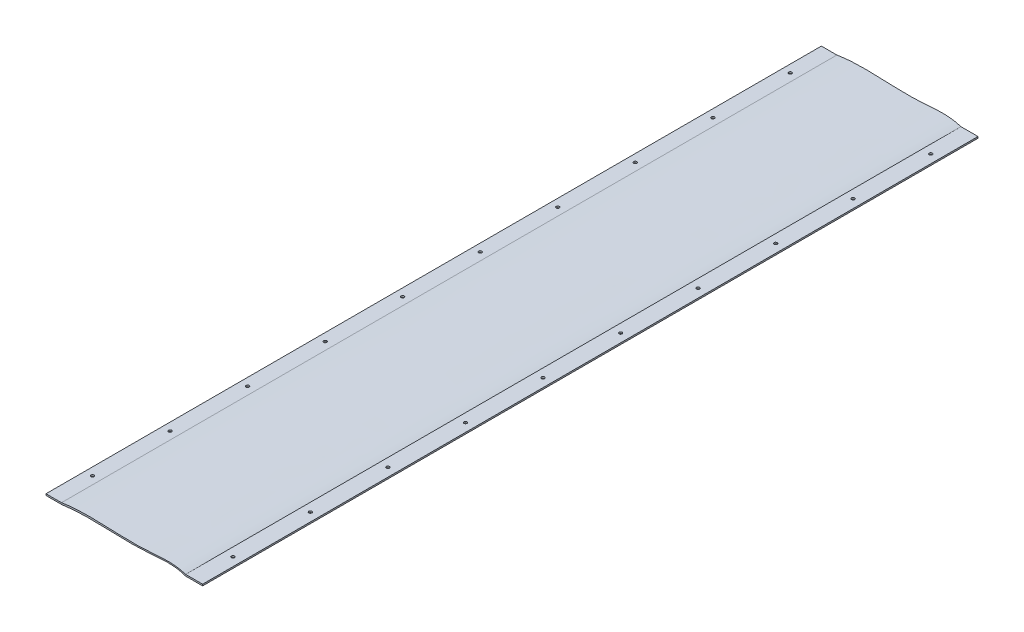
ISO-10303-21;
HEADER;
FILE_DESCRIPTION(('STEP AP214'),'2;1');
FILE_NAME('part.step','',(''),(''),'','','');
FILE_SCHEMA(('AUTOMOTIVE_DESIGN { 1 0 10303 214 1 1 1 1 }'));
ENDSEC;
DATA;
#1=APPLICATION_CONTEXT('core data for automotive mechanical design processes');
#2=APPLICATION_PROTOCOL_DEFINITION('international standard','automotive_design',2000,#1);
#3=PRODUCT_CONTEXT('',#1,'mechanical');
#4=PRODUCT('Part','Part','',(#3));
#5=PRODUCT_RELATED_PRODUCT_CATEGORY('part','',(#4));
#6=PRODUCT_DEFINITION_FORMATION('','',#4);
#7=PRODUCT_DEFINITION_CONTEXT('part definition',#1,'design');
#8=PRODUCT_DEFINITION('design','',#6,#7);
#9=PRODUCT_DEFINITION_SHAPE('','',#8);
#10=(LENGTH_UNIT() NAMED_UNIT(*) SI_UNIT(.MILLI.,.METRE.));
#11=(NAMED_UNIT(*) PLANE_ANGLE_UNIT() SI_UNIT($,.RADIAN.));
#12=(NAMED_UNIT(*) SI_UNIT($,.STERADIAN.) SOLID_ANGLE_UNIT());
#13=UNCERTAINTY_MEASURE_WITH_UNIT(LENGTH_MEASURE(1.E-05),#10,'distance_accuracy_value','');
#14=(GEOMETRIC_REPRESENTATION_CONTEXT(3) GLOBAL_UNCERTAINTY_ASSIGNED_CONTEXT((#13)) GLOBAL_UNIT_ASSIGNED_CONTEXT((#10,
#11,#12)) REPRESENTATION_CONTEXT('',''));
#15=CARTESIAN_POINT('',(0.,0.,0.));
#16=DIRECTION('',(0.,0.,1.));
#17=DIRECTION('',(1.,0.,0.));
#18=AXIS2_PLACEMENT_3D('',#15,#16,#17);
#19=CARTESIAN_POINT('',(102.,0.,-1000.));
#20=DIRECTION('',(0.,-1.,0.));
#21=DIRECTION('',(1.,0.,0.));
#22=AXIS2_PLACEMENT_3D('',#19,#20,#21);
#23=PLANE('',#22);
#24=CARTESIAN_POINT('',(91.,0.,-350.));
#25=DIRECTION('',(0.,-1.,0.));
#26=DIRECTION('',(1.,0.,0.));
#27=AXIS2_PLACEMENT_3D('',#24,#25,#26);
#28=CIRCLE('',#27,2.);
#29=CARTESIAN_POINT('',(93.,0.,-350.));
#30=VERTEX_POINT('',#29);
#31=EDGE_CURVE('E205',#30,#30,#28,.T.);
#32=ORIENTED_EDGE('',*,*,#31,.F.);
#33=EDGE_LOOP('',(#32));
#34=FACE_BOUND('',#33,.T.);
#35=CARTESIAN_POINT('',(91.,0.,-450.));
#36=DIRECTION('',(0.,-1.,0.));
#37=DIRECTION('',(1.,0.,0.));
#38=AXIS2_PLACEMENT_3D('',#35,#36,#37);
#39=CIRCLE('',#38,2.);
#40=CARTESIAN_POINT('',(93.,0.,-450.));
#41=VERTEX_POINT('',#40);
#42=EDGE_CURVE('E208',#41,#41,#39,.T.);
#43=ORIENTED_EDGE('',*,*,#42,.F.);
#44=EDGE_LOOP('',(#43));
#45=FACE_BOUND('',#44,.T.);
#46=CARTESIAN_POINT('',(91.,0.,-150.));
#47=DIRECTION('',(0.,-1.,0.));
#48=DIRECTION('',(1.,0.,0.));
#49=AXIS2_PLACEMENT_3D('',#46,#47,#48);
#50=CIRCLE('',#49,2.);
#51=CARTESIAN_POINT('',(93.,0.,-150.));
#52=VERTEX_POINT('',#51);
#53=EDGE_CURVE('E211',#52,#52,#50,.T.);
#54=ORIENTED_EDGE('',*,*,#53,.F.);
#55=EDGE_LOOP('',(#54));
#56=FACE_BOUND('',#55,.T.);
#57=CARTESIAN_POINT('',(91.,0.,-250.));
#58=DIRECTION('',(0.,-1.,0.));
#59=DIRECTION('',(1.,0.,0.));
#60=AXIS2_PLACEMENT_3D('',#57,#58,#59);
#61=CIRCLE('',#60,2.);
#62=CARTESIAN_POINT('',(93.,0.,-250.));
#63=VERTEX_POINT('',#62);
#64=EDGE_CURVE('E214',#63,#63,#61,.T.);
#65=ORIENTED_EDGE('',*,*,#64,.F.);
#66=EDGE_LOOP('',(#65));
#67=FACE_BOUND('',#66,.T.);
#68=CARTESIAN_POINT('',(91.,0.,-750.));
#69=DIRECTION('',(0.,-1.,0.));
#70=DIRECTION('',(1.,0.,0.));
#71=AXIS2_PLACEMENT_3D('',#68,#69,#70);
#72=CIRCLE('',#71,2.);
#73=CARTESIAN_POINT('',(93.,0.,-750.));
#74=VERTEX_POINT('',#73);
#75=EDGE_CURVE('E217',#74,#74,#72,.T.);
#76=ORIENTED_EDGE('',*,*,#75,.F.);
#77=EDGE_LOOP('',(#76));
#78=FACE_BOUND('',#77,.T.);
#79=CARTESIAN_POINT('',(91.,0.,-850.));
#80=DIRECTION('',(0.,-1.,0.));
#81=DIRECTION('',(1.,0.,0.));
#82=AXIS2_PLACEMENT_3D('',#79,#80,#81);
#83=CIRCLE('',#82,2.);
#84=CARTESIAN_POINT('',(93.,0.,-850.));
#85=VERTEX_POINT('',#84);
#86=EDGE_CURVE('E220',#85,#85,#83,.T.);
#87=ORIENTED_EDGE('',*,*,#86,.F.);
#88=EDGE_LOOP('',(#87));
#89=FACE_BOUND('',#88,.T.);
#90=CARTESIAN_POINT('',(91.,0.,-550.));
#91=DIRECTION('',(0.,-1.,0.));
#92=DIRECTION('',(1.,0.,0.));
#93=AXIS2_PLACEMENT_3D('',#90,#91,#92);
#94=CIRCLE('',#93,2.);
#95=CARTESIAN_POINT('',(93.,0.,-550.));
#96=VERTEX_POINT('',#95);
#97=EDGE_CURVE('E223',#96,#96,#94,.T.);
#98=ORIENTED_EDGE('',*,*,#97,.F.);
#99=EDGE_LOOP('',(#98));
#100=FACE_BOUND('',#99,.T.);
#101=CARTESIAN_POINT('',(91.,0.,-650.));
#102=DIRECTION('',(0.,-1.,0.));
#103=DIRECTION('',(1.,0.,0.));
#104=AXIS2_PLACEMENT_3D('',#101,#102,#103);
#105=CIRCLE('',#104,2.);
#106=CARTESIAN_POINT('',(93.,0.,-650.));
#107=VERTEX_POINT('',#106);
#108=EDGE_CURVE('E226',#107,#107,#105,.T.);
#109=ORIENTED_EDGE('',*,*,#108,.F.);
#110=EDGE_LOOP('',(#109));
#111=FACE_BOUND('',#110,.T.);
#112=CARTESIAN_POINT('',(91.,0.,-49.9999999999999));
#113=DIRECTION('',(0.,-1.,0.));
#114=DIRECTION('',(1.,0.,0.));
#115=AXIS2_PLACEMENT_3D('',#112,#113,#114);
#116=CIRCLE('',#115,2.);
#117=CARTESIAN_POINT('',(93.,0.,-49.9999999999999));
#118=VERTEX_POINT('',#117);
#119=EDGE_CURVE('E229',#118,#118,#116,.T.);
#120=ORIENTED_EDGE('',*,*,#119,.F.);
#121=EDGE_LOOP('',(#120));
#122=FACE_BOUND('',#121,.T.);
#123=CARTESIAN_POINT('',(91.,0.,-950.));
#124=DIRECTION('',(0.,-1.,0.));
#125=DIRECTION('',(1.,0.,0.));
#126=AXIS2_PLACEMENT_3D('',#123,#124,#125);
#127=CIRCLE('',#126,2.);
#128=CARTESIAN_POINT('',(93.,0.,-950.));
#129=VERTEX_POINT('',#128);
#130=EDGE_CURVE('E232',#129,#129,#127,.T.);
#131=ORIENTED_EDGE('',*,*,#130,.F.);
#132=EDGE_LOOP('',(#131));
#133=FACE_BOUND('',#132,.T.);
#134=DIRECTION('',(1.,0.,0.));
#135=VECTOR('',#134,1.);
#136=CARTESIAN_POINT('',(102.,0.,0.));
#137=LINE('',#136,#135);
#138=CARTESIAN_POINT('',(80.,0.,0.));
#139=VERTEX_POINT('',#138);
#140=CARTESIAN_POINT('',(102.,0.,0.));
#141=VERTEX_POINT('',#140);
#142=EDGE_CURVE('E133',#139,#141,#137,.T.);
#143=ORIENTED_EDGE('',*,*,#142,.F.);
#144=DIRECTION('',(0.,0.,1.));
#145=VECTOR('',#144,1.);
#146=CARTESIAN_POINT('',(80.,0.,-1000.));
#147=LINE('',#146,#145);
#148=CARTESIAN_POINT('',(80.,0.,-1000.));
#149=VERTEX_POINT('',#148);
#150=EDGE_CURVE('E11',#149,#139,#147,.T.);
#151=ORIENTED_EDGE('',*,*,#150,.F.);
#152=DIRECTION('',(1.,0.,0.));
#153=VECTOR('',#152,1.);
#154=CARTESIAN_POINT('',(102.,0.,-1000.));
#155=LINE('',#154,#153);
#156=CARTESIAN_POINT('',(102.,0.,-1000.));
#157=VERTEX_POINT('',#156);
#158=EDGE_CURVE('E172',#149,#157,#155,.T.);
#159=ORIENTED_EDGE('',*,*,#158,.T.);
#160=DIRECTION('',(0.,0.,1.));
#161=VECTOR('',#160,1.);
#162=CARTESIAN_POINT('',(102.,0.,-1000.));
#163=LINE('',#162,#161);
#164=EDGE_CURVE('E36',#157,#141,#163,.T.);
#165=ORIENTED_EDGE('',*,*,#164,.T.);
#166=EDGE_LOOP('',(#143,#151,#159,#165));
#167=FACE_BOUND('',#166,.T.);
#168=ADVANCED_FACE('F33',(#34,#45,#56,#67,#78,#89,#100,#111,#122,#133,#167),#23,.T.);
#169=CARTESIAN_POINT('',(-80.,0.,-1000.));
#170=CARTESIAN_POINT('',(-43.5718899543905,5.40235593504601,-1000.));
#171=CARTESIAN_POINT('',(9.73908281626288,-3.25283054372847,-1000.));
#172=CARTESIAN_POINT('',(63.4152022781051,6.1771333399444,-1000.));
#173=CARTESIAN_POINT('',(80.,0.,-1000.));
#174=B_SPLINE_CURVE_WITH_KNOTS('',3,(#169,#170,#171,#172,#173),.UNSPECIFIED.,.F.,.F.,(4,1,4),
(0.,0.680838855232895,1.),.UNSPECIFIED.);
#175=DIRECTION('',(0.,0.,1.));
#176=VECTOR('',#175,1.);
#177=SURFACE_OF_LINEAR_EXTRUSION('',#174,#176);
#178=CARTESIAN_POINT('',(-80.,0.,0.));
#179=CARTESIAN_POINT('',(-43.5718899543905,5.40235593504601,0.));
#180=CARTESIAN_POINT('',(9.73908281626288,-3.25283054372847,0.));
#181=CARTESIAN_POINT('',(63.4152022781051,6.1771333399444,0.));
#182=CARTESIAN_POINT('',(80.,0.,0.));
#183=B_SPLINE_CURVE_WITH_KNOTS('',3,(#178,#179,#180,#181,#182),.UNSPECIFIED.,.F.,.F.,(4,1,4),
(0.,0.680838855232895,1.),.UNSPECIFIED.);
#184=CARTESIAN_POINT('',(-80.,0.,0.));
#185=VERTEX_POINT('',#184);
#186=EDGE_CURVE('E174',#185,#139,#183,.T.);
#187=ORIENTED_EDGE('',*,*,#186,.F.);
#188=DIRECTION('',(0.,0.,1.));
#189=VECTOR('',#188,1.);
#190=CARTESIAN_POINT('',(-80.,0.,-1000.));
#191=LINE('',#190,#189);
#192=CARTESIAN_POINT('',(-80.,0.,-1000.));
#193=VERTEX_POINT('',#192);
#194=EDGE_CURVE('E42',#193,#185,#191,.T.);
#195=ORIENTED_EDGE('',*,*,#194,.F.);
#196=EDGE_CURVE('E120',#193,#149,#174,.T.);
#197=ORIENTED_EDGE('',*,*,#196,.T.);
#198=ORIENTED_EDGE('',*,*,#150,.T.);
#199=EDGE_LOOP('',(#187,#195,#197,#198));
#200=FACE_BOUND('',#199,.T.);
#201=ADVANCED_FACE('F139',(#200),#177,.T.);
#202=CARTESIAN_POINT('',(-100.,0.,-1000.));
#203=DIRECTION('',(0.,-1.,0.));
#204=DIRECTION('',(0.,0.,-1.));
#205=AXIS2_PLACEMENT_3D('',#202,#203,#204);
#206=PLANE('',#205);
#207=CARTESIAN_POINT('',(-90.,0.,-450.));
#208=DIRECTION('',(0.,-1.,0.));
#209=DIRECTION('',(0.,0.,-1.));
#210=AXIS2_PLACEMENT_3D('',#207,#208,#209);
#211=CIRCLE('',#210,2.);
#212=CARTESIAN_POINT('',(-90.,0.,-452.));
#213=VERTEX_POINT('',#212);
#214=EDGE_CURVE('E175',#213,#213,#211,.T.);
#215=ORIENTED_EDGE('',*,*,#214,.F.);
#216=EDGE_LOOP('',(#215));
#217=FACE_BOUND('',#216,.T.);
#218=CARTESIAN_POINT('',(-90.,0.,-550.));
#219=DIRECTION('',(0.,-1.,0.));
#220=DIRECTION('',(0.,0.,-1.));
#221=AXIS2_PLACEMENT_3D('',#218,#219,#220);
#222=CIRCLE('',#221,2.);
#223=CARTESIAN_POINT('',(-90.,0.,-552.));
#224=VERTEX_POINT('',#223);
#225=EDGE_CURVE('E178',#224,#224,#222,.T.);
#226=ORIENTED_EDGE('',*,*,#225,.F.);
#227=EDGE_LOOP('',(#226));
#228=FACE_BOUND('',#227,.T.);
#229=CARTESIAN_POINT('',(-90.,0.,-250.));
#230=DIRECTION('',(0.,-1.,0.));
#231=DIRECTION('',(0.,0.,-1.));
#232=AXIS2_PLACEMENT_3D('',#229,#230,#231);
#233=CIRCLE('',#232,2.);
#234=CARTESIAN_POINT('',(-90.,0.,-252.));
#235=VERTEX_POINT('',#234);
#236=EDGE_CURVE('E181',#235,#235,#233,.T.);
#237=ORIENTED_EDGE('',*,*,#236,.F.);
#238=EDGE_LOOP('',(#237));
#239=FACE_BOUND('',#238,.T.);
#240=CARTESIAN_POINT('',(-90.,0.,-350.));
#241=DIRECTION('',(0.,-1.,0.));
#242=DIRECTION('',(0.,0.,-1.));
#243=AXIS2_PLACEMENT_3D('',#240,#241,#242);
#244=CIRCLE('',#243,2.);
#245=CARTESIAN_POINT('',(-90.,0.,-352.));
#246=VERTEX_POINT('',#245);
#247=EDGE_CURVE('E184',#246,#246,#244,.T.);
#248=ORIENTED_EDGE('',*,*,#247,.F.);
#249=EDGE_LOOP('',(#248));
#250=FACE_BOUND('',#249,.T.);
#251=CARTESIAN_POINT('',(-90.,0.,-850.));
#252=DIRECTION('',(0.,-1.,0.));
#253=DIRECTION('',(0.,0.,-1.));
#254=AXIS2_PLACEMENT_3D('',#251,#252,#253);
#255=CIRCLE('',#254,2.);
#256=CARTESIAN_POINT('',(-90.,0.,-852.));
#257=VERTEX_POINT('',#256);
#258=EDGE_CURVE('E187',#257,#257,#255,.T.);
#259=ORIENTED_EDGE('',*,*,#258,.F.);
#260=EDGE_LOOP('',(#259));
#261=FACE_BOUND('',#260,.T.);
#262=CARTESIAN_POINT('',(-90.,0.,-950.));
#263=DIRECTION('',(0.,-1.,0.));
#264=DIRECTION('',(0.,0.,-1.));
#265=AXIS2_PLACEMENT_3D('',#262,#263,#264);
#266=CIRCLE('',#265,2.);
#267=CARTESIAN_POINT('',(-90.,0.,-952.));
#268=VERTEX_POINT('',#267);
#269=EDGE_CURVE('E190',#268,#268,#266,.T.);
#270=ORIENTED_EDGE('',*,*,#269,.F.);
#271=EDGE_LOOP('',(#270));
#272=FACE_BOUND('',#271,.T.);
#273=CARTESIAN_POINT('',(-90.,0.,-650.));
#274=DIRECTION('',(0.,-1.,0.));
#275=DIRECTION('',(0.,0.,-1.));
#276=AXIS2_PLACEMENT_3D('',#273,#274,#275);
#277=CIRCLE('',#276,2.);
#278=CARTESIAN_POINT('',(-90.,0.,-652.));
#279=VERTEX_POINT('',#278);
#280=EDGE_CURVE('E193',#279,#279,#277,.T.);
#281=ORIENTED_EDGE('',*,*,#280,.F.);
#282=EDGE_LOOP('',(#281));
#283=FACE_BOUND('',#282,.T.);
#284=CARTESIAN_POINT('',(-90.,0.,-750.));
#285=DIRECTION('',(0.,-1.,0.));
#286=DIRECTION('',(0.,0.,-1.));
#287=AXIS2_PLACEMENT_3D('',#284,#285,#286);
#288=CIRCLE('',#287,2.);
#289=CARTESIAN_POINT('',(-90.,0.,-752.));
#290=VERTEX_POINT('',#289);
#291=EDGE_CURVE('E196',#290,#290,#288,.T.);
#292=ORIENTED_EDGE('',*,*,#291,.F.);
#293=EDGE_LOOP('',(#292));
#294=FACE_BOUND('',#293,.T.);
#295=CARTESIAN_POINT('',(-90.,0.,-49.9999999999999));
#296=DIRECTION('',(0.,-1.,0.));
#297=DIRECTION('',(0.,0.,-1.));
#298=AXIS2_PLACEMENT_3D('',#295,#296,#297);
#299=CIRCLE('',#298,2.);
#300=CARTESIAN_POINT('',(-90.,0.,-51.9999999999999));
#301=VERTEX_POINT('',#300);
#302=EDGE_CURVE('E199',#301,#301,#299,.T.);
#303=ORIENTED_EDGE('',*,*,#302,.F.);
#304=EDGE_LOOP('',(#303));
#305=FACE_BOUND('',#304,.T.);
#306=CARTESIAN_POINT('',(-90.,0.,-150.));
#307=DIRECTION('',(0.,-1.,0.));
#308=DIRECTION('',(0.,0.,-1.));
#309=AXIS2_PLACEMENT_3D('',#306,#307,#308);
#310=CIRCLE('',#309,2.);
#311=CARTESIAN_POINT('',(-90.,0.,-152.));
#312=VERTEX_POINT('',#311);
#313=EDGE_CURVE('E202',#312,#312,#310,.T.);
#314=ORIENTED_EDGE('',*,*,#313,.F.);
#315=EDGE_LOOP('',(#314));
#316=FACE_BOUND('',#315,.T.);
#317=DIRECTION('',(1.,0.,0.));
#318=VECTOR('',#317,1.);
#319=CARTESIAN_POINT('',(-100.,0.,0.));
#320=LINE('',#319,#318);
#321=CARTESIAN_POINT('',(-100.,0.,0.));
#322=VERTEX_POINT('',#321);
#323=EDGE_CURVE('E107',#322,#185,#320,.T.);
#324=ORIENTED_EDGE('',*,*,#323,.F.);
#325=DIRECTION('',(0.,0.,1.));
#326=VECTOR('',#325,1.);
#327=CARTESIAN_POINT('',(-100.,0.,-1000.));
#328=LINE('',#327,#326);
#329=CARTESIAN_POINT('',(-100.,0.,-1000.));
#330=VERTEX_POINT('',#329);
#331=EDGE_CURVE('E102',#330,#322,#328,.T.);
#332=ORIENTED_EDGE('',*,*,#331,.F.);
#333=DIRECTION('',(1.,0.,0.));
#334=VECTOR('',#333,1.);
#335=CARTESIAN_POINT('',(-100.,0.,-1000.));
#336=LINE('',#335,#334);
#337=EDGE_CURVE('E105',#330,#193,#336,.T.);
#338=ORIENTED_EDGE('',*,*,#337,.T.);
#339=ORIENTED_EDGE('',*,*,#194,.T.);
#340=EDGE_LOOP('',(#324,#332,#338,#339));
#341=FACE_BOUND('',#340,.T.);
#342=ADVANCED_FACE('F104',(#217,#228,#239,#250,#261,#272,#283,#294,#305,#316,#341),#206,.T.);
#343=CARTESIAN_POINT('',(-100.,0.,-1000.));
#344=DIRECTION('',(-1.,0.,0.));
#345=DIRECTION('',(0.,0.,1.));
#346=AXIS2_PLACEMENT_3D('',#343,#344,#345);
#347=PLANE('',#346);
#348=DIRECTION('',(0.,-1.,0.));
#349=VECTOR('',#348,1.);
#350=CARTESIAN_POINT('',(-100.,0.,0.));
#351=LINE('',#350,#349);
#352=CARTESIAN_POINT('',(-100.,2.,0.));
#353=VERTEX_POINT('',#352);
#354=EDGE_CURVE('E307',#353,#322,#351,.T.);
#355=ORIENTED_EDGE('',*,*,#354,.F.);
#356=DIRECTION('',(0.,0.,1.));
#357=VECTOR('',#356,1.);
#358=CARTESIAN_POINT('',(-100.,2.,-1000.));
#359=LINE('',#358,#357);
#360=CARTESIAN_POINT('',(-100.,2.,-1000.));
#361=VERTEX_POINT('',#360);
#362=EDGE_CURVE('E112',#361,#353,#359,.T.);
#363=ORIENTED_EDGE('',*,*,#362,.F.);
#364=DIRECTION('',(0.,-1.,0.));
#365=VECTOR('',#364,1.);
#366=CARTESIAN_POINT('',(-100.,0.,-1000.));
#367=LINE('',#366,#365);
#368=EDGE_CURVE('E118',#361,#330,#367,.T.);
#369=ORIENTED_EDGE('',*,*,#368,.T.);
#370=ORIENTED_EDGE('',*,*,#331,.T.);
#371=EDGE_LOOP('',(#355,#363,#369,#370));
#372=FACE_BOUND('',#371,.T.);
#373=ADVANCED_FACE('F122',(#372),#347,.T.);
#374=CARTESIAN_POINT('',(-100.,2.,-1000.));
#375=DIRECTION('',(0.,1.,0.));
#376=DIRECTION('',(0.,0.,1.));
#377=AXIS2_PLACEMENT_3D('',#374,#375,#376);
#378=PLANE('',#377);
#379=CARTESIAN_POINT('',(-90.,1.99999999999997,-450.));
#380=DIRECTION('',(0.,1.,0.));
#381=DIRECTION('',(-1.,0.,0.));
#382=AXIS2_PLACEMENT_3D('',#379,#380,#381);
#383=CIRCLE('',#382,2.);
#384=CARTESIAN_POINT('',(-92.,1.99999999999997,-450.));
#385=VERTEX_POINT('',#384);
#386=EDGE_CURVE('E266',#385,#385,#383,.T.);
#387=ORIENTED_EDGE('',*,*,#386,.F.);
#388=EDGE_LOOP('',(#387));
#389=FACE_BOUND('',#388,.T.);
#390=CARTESIAN_POINT('',(-90.,1.99999999999997,-550.));
#391=DIRECTION('',(0.,1.,0.));
#392=DIRECTION('',(-1.,0.,0.));
#393=AXIS2_PLACEMENT_3D('',#390,#391,#392);
#394=CIRCLE('',#393,2.);
#395=CARTESIAN_POINT('',(-92.,1.99999999999997,-550.));
#396=VERTEX_POINT('',#395);
#397=EDGE_CURVE('E260',#396,#396,#394,.T.);
#398=ORIENTED_EDGE('',*,*,#397,.F.);
#399=EDGE_LOOP('',(#398));
#400=FACE_BOUND('',#399,.T.);
#401=CARTESIAN_POINT('',(-90.,1.99999999999997,-250.));
#402=DIRECTION('',(0.,1.,0.));
#403=DIRECTION('',(-1.,0.,0.));
#404=AXIS2_PLACEMENT_3D('',#401,#402,#403);
#405=CIRCLE('',#404,2.);
#406=CARTESIAN_POINT('',(-92.,1.99999999999997,-250.));
#407=VERTEX_POINT('',#406);
#408=EDGE_CURVE('E278',#407,#407,#405,.T.);
#409=ORIENTED_EDGE('',*,*,#408,.F.);
#410=EDGE_LOOP('',(#409));
#411=FACE_BOUND('',#410,.T.);
#412=CARTESIAN_POINT('',(-90.,1.99999999999997,-350.));
#413=DIRECTION('',(0.,1.,0.));
#414=DIRECTION('',(-1.,0.,0.));
#415=AXIS2_PLACEMENT_3D('',#412,#413,#414);
#416=CIRCLE('',#415,2.);
#417=CARTESIAN_POINT('',(-92.,1.99999999999997,-350.));
#418=VERTEX_POINT('',#417);
#419=EDGE_CURVE('E272',#418,#418,#416,.T.);
#420=ORIENTED_EDGE('',*,*,#419,.F.);
#421=EDGE_LOOP('',(#420));
#422=FACE_BOUND('',#421,.T.);
#423=CARTESIAN_POINT('',(-90.,1.99999999999997,-850.));
#424=DIRECTION('',(0.,1.,0.));
#425=DIRECTION('',(-1.,0.,0.));
#426=AXIS2_PLACEMENT_3D('',#423,#424,#425);
#427=CIRCLE('',#426,2.);
#428=CARTESIAN_POINT('',(-92.,1.99999999999997,-850.));
#429=VERTEX_POINT('',#428);
#430=EDGE_CURVE('E242',#429,#429,#427,.T.);
#431=ORIENTED_EDGE('',*,*,#430,.F.);
#432=EDGE_LOOP('',(#431));
#433=FACE_BOUND('',#432,.T.);
#434=CARTESIAN_POINT('',(-90.,1.99999999999997,-950.));
#435=DIRECTION('',(0.,1.,0.));
#436=DIRECTION('',(-1.,0.,0.));
#437=AXIS2_PLACEMENT_3D('',#434,#435,#436);
#438=CIRCLE('',#437,2.);
#439=CARTESIAN_POINT('',(-92.,1.99999999999997,-950.));
#440=VERTEX_POINT('',#439);
#441=EDGE_CURVE('E238',#440,#440,#438,.T.);
#442=ORIENTED_EDGE('',*,*,#441,.F.);
#443=EDGE_LOOP('',(#442));
#444=FACE_BOUND('',#443,.T.);
#445=CARTESIAN_POINT('',(-90.,1.99999999999997,-650.));
#446=DIRECTION('',(0.,1.,0.));
#447=DIRECTION('',(-1.,0.,0.));
#448=AXIS2_PLACEMENT_3D('',#445,#446,#447);
#449=CIRCLE('',#448,2.);
#450=CARTESIAN_POINT('',(-92.,1.99999999999997,-650.));
#451=VERTEX_POINT('',#450);
#452=EDGE_CURVE('E254',#451,#451,#449,.T.);
#453=ORIENTED_EDGE('',*,*,#452,.F.);
#454=EDGE_LOOP('',(#453));
#455=FACE_BOUND('',#454,.T.);
#456=CARTESIAN_POINT('',(-90.,1.99999999999997,-750.));
#457=DIRECTION('',(0.,1.,0.));
#458=DIRECTION('',(-1.,0.,0.));
#459=AXIS2_PLACEMENT_3D('',#456,#457,#458);
#460=CIRCLE('',#459,2.);
#461=CARTESIAN_POINT('',(-92.,1.99999999999997,-750.));
#462=VERTEX_POINT('',#461);
#463=EDGE_CURVE('E248',#462,#462,#460,.T.);
#464=ORIENTED_EDGE('',*,*,#463,.F.);
#465=EDGE_LOOP('',(#464));
#466=FACE_BOUND('',#465,.T.);
#467=CARTESIAN_POINT('',(-90.,1.99999999999997,-49.9999999999999));
#468=DIRECTION('',(0.,1.,0.));
#469=DIRECTION('',(-1.,0.,0.));
#470=AXIS2_PLACEMENT_3D('',#467,#468,#469);
#471=CIRCLE('',#470,2.);
#472=CARTESIAN_POINT('',(-92.,1.99999999999997,-49.9999999999999));
#473=VERTEX_POINT('',#472);
#474=EDGE_CURVE('E290',#473,#473,#471,.T.);
#475=ORIENTED_EDGE('',*,*,#474,.F.);
#476=EDGE_LOOP('',(#475));
#477=FACE_BOUND('',#476,.T.);
#478=CARTESIAN_POINT('',(-90.,1.99999999999997,-150.));
#479=DIRECTION('',(0.,1.,0.));
#480=DIRECTION('',(-1.,0.,0.));
#481=AXIS2_PLACEMENT_3D('',#478,#479,#480);
#482=CIRCLE('',#481,2.);
#483=CARTESIAN_POINT('',(-92.,1.99999999999997,-150.));
#484=VERTEX_POINT('',#483);
#485=EDGE_CURVE('E284',#484,#484,#482,.T.);
#486=ORIENTED_EDGE('',*,*,#485,.F.);
#487=EDGE_LOOP('',(#486));
#488=FACE_BOUND('',#487,.T.);
#489=DIRECTION('',(-1.,0.,0.));
#490=VECTOR('',#489,1.);
#491=CARTESIAN_POINT('',(-100.,2.,0.));
#492=LINE('',#491,#490);
#493=CARTESIAN_POINT('',(-80.,2.,0.));
#494=VERTEX_POINT('',#493);
#495=EDGE_CURVE('E303',#494,#353,#492,.T.);
#496=ORIENTED_EDGE('',*,*,#495,.F.);
#497=DIRECTION('',(0.,0.,1.));
#498=VECTOR('',#497,1.);
#499=CARTESIAN_POINT('',(-80.,2.,-1000.));
#500=LINE('',#499,#498);
#501=CARTESIAN_POINT('',(-80.,2.,-1000.));
#502=VERTEX_POINT('',#501);
#503=EDGE_CURVE('E305',#502,#494,#500,.T.);
#504=ORIENTED_EDGE('',*,*,#503,.F.);
#505=DIRECTION('',(-1.,0.,0.));
#506=VECTOR('',#505,1.);
#507=CARTESIAN_POINT('',(-100.,2.,-1000.));
#508=LINE('',#507,#506);
#509=EDGE_CURVE('E123',#502,#361,#508,.T.);
#510=ORIENTED_EDGE('',*,*,#509,.T.);
#511=ORIENTED_EDGE('',*,*,#362,.T.);
#512=EDGE_LOOP('',(#496,#504,#510,#511));
#513=FACE_BOUND('',#512,.T.);
#514=ADVANCED_FACE('F150',(#389,#400,#411,#422,#433,#444,#455,#466,#477,#488,#513),#378,.T.);
#515=CARTESIAN_POINT('',(80.,2.,-1000.));
#516=CARTESIAN_POINT('',(63.3342894041742,7.53492438273297,-1000.));
#517=CARTESIAN_POINT('',(9.73859292177058,-1.46829952400253,-1000.));
#518=CARTESIAN_POINT('',(-43.5921406650026,8.04062485885661,-1000.));
#519=CARTESIAN_POINT('',(-80.,2.,-1000.));
#520=B_SPLINE_CURVE_WITH_KNOTS('',3,(#515,#516,#517,#518,#519),.UNSPECIFIED.,.F.,.F.,(4,1,4),
(0.,0.318789426189634,1.),.UNSPECIFIED.);
#521=DIRECTION('',(0.,0.,1.));
#522=VECTOR('',#521,1.);
#523=SURFACE_OF_LINEAR_EXTRUSION('',#520,#522);
#524=CARTESIAN_POINT('',(80.,2.,0.));
#525=CARTESIAN_POINT('',(63.3342894041742,7.53492438273297,0.));
#526=CARTESIAN_POINT('',(9.73859292177058,-1.46829952400253,0.));
#527=CARTESIAN_POINT('',(-43.5921406650026,8.04062485885661,0.));
#528=CARTESIAN_POINT('',(-80.,2.,0.));
#529=B_SPLINE_CURVE_WITH_KNOTS('',3,(#524,#525,#526,#527,#528),.UNSPECIFIED.,.F.,.F.,(4,1,4),
(0.,0.318789426189634,1.),.UNSPECIFIED.);
#530=CARTESIAN_POINT('',(80.,2.,0.));
#531=VERTEX_POINT('',#530);
#532=EDGE_CURVE('E308',#531,#494,#529,.T.);
#533=ORIENTED_EDGE('',*,*,#532,.F.);
#534=DIRECTION('',(0.,0.,1.));
#535=VECTOR('',#534,1.);
#536=CARTESIAN_POINT('',(80.,2.,-1000.));
#537=LINE('',#536,#535);
#538=CARTESIAN_POINT('',(80.,2.,-1000.));
#539=VERTEX_POINT('',#538);
#540=EDGE_CURVE('E337',#539,#531,#537,.T.);
#541=ORIENTED_EDGE('',*,*,#540,.F.);
#542=EDGE_CURVE('E125',#539,#502,#520,.T.);
#543=ORIENTED_EDGE('',*,*,#542,.T.);
#544=ORIENTED_EDGE('',*,*,#503,.T.);
#545=EDGE_LOOP('',(#533,#541,#543,#544));
#546=FACE_BOUND('',#545,.T.);
#547=ADVANCED_FACE('F153',(#546),#523,.T.);
#548=CARTESIAN_POINT('',(102.,2.,-1000.));
#549=DIRECTION('',(0.,1.,0.));
#550=DIRECTION('',(-1.,0.,0.));
#551=AXIS2_PLACEMENT_3D('',#548,#549,#550);
#552=PLANE('',#551);
#553=CARTESIAN_POINT('',(91.,2.,-350.));
#554=DIRECTION('',(0.,1.,0.));
#555=DIRECTION('',(-1.,0.,0.));
#556=AXIS2_PLACEMENT_3D('',#553,#554,#555);
#557=CIRCLE('',#556,2.);
#558=CARTESIAN_POINT('',(89.,2.,-350.));
#559=VERTEX_POINT('',#558);
#560=EDGE_CURVE('E269',#559,#559,#557,.T.);
#561=ORIENTED_EDGE('',*,*,#560,.F.);
#562=EDGE_LOOP('',(#561));
#563=FACE_BOUND('',#562,.T.);
#564=CARTESIAN_POINT('',(91.,2.,-450.));
#565=DIRECTION('',(0.,1.,0.));
#566=DIRECTION('',(-1.,0.,0.));
#567=AXIS2_PLACEMENT_3D('',#564,#565,#566);
#568=CIRCLE('',#567,2.);
#569=CARTESIAN_POINT('',(89.,2.,-450.));
#570=VERTEX_POINT('',#569);
#571=EDGE_CURVE('E263',#570,#570,#568,.T.);
#572=ORIENTED_EDGE('',*,*,#571,.F.);
#573=EDGE_LOOP('',(#572));
#574=FACE_BOUND('',#573,.T.);
#575=CARTESIAN_POINT('',(91.,2.,-150.));
#576=DIRECTION('',(0.,1.,0.));
#577=DIRECTION('',(-1.,0.,0.));
#578=AXIS2_PLACEMENT_3D('',#575,#576,#577);
#579=CIRCLE('',#578,2.);
#580=CARTESIAN_POINT('',(89.,2.,-150.));
#581=VERTEX_POINT('',#580);
#582=EDGE_CURVE('E281',#581,#581,#579,.T.);
#583=ORIENTED_EDGE('',*,*,#582,.F.);
#584=EDGE_LOOP('',(#583));
#585=FACE_BOUND('',#584,.T.);
#586=CARTESIAN_POINT('',(91.,2.,-250.));
#587=DIRECTION('',(0.,1.,0.));
#588=DIRECTION('',(-1.,0.,0.));
#589=AXIS2_PLACEMENT_3D('',#586,#587,#588);
#590=CIRCLE('',#589,2.);
#591=CARTESIAN_POINT('',(89.,2.,-250.));
#592=VERTEX_POINT('',#591);
#593=EDGE_CURVE('E275',#592,#592,#590,.T.);
#594=ORIENTED_EDGE('',*,*,#593,.F.);
#595=EDGE_LOOP('',(#594));
#596=FACE_BOUND('',#595,.T.);
#597=CARTESIAN_POINT('',(91.,2.,-750.));
#598=DIRECTION('',(0.,1.,0.));
#599=DIRECTION('',(-1.,0.,0.));
#600=AXIS2_PLACEMENT_3D('',#597,#598,#599);
#601=CIRCLE('',#600,2.);
#602=CARTESIAN_POINT('',(89.,2.,-750.));
#603=VERTEX_POINT('',#602);
#604=EDGE_CURVE('E245',#603,#603,#601,.T.);
#605=ORIENTED_EDGE('',*,*,#604,.F.);
#606=EDGE_LOOP('',(#605));
#607=FACE_BOUND('',#606,.T.);
#608=CARTESIAN_POINT('',(91.,2.,-850.));
#609=DIRECTION('',(0.,1.,0.));
#610=DIRECTION('',(-1.,0.,0.));
#611=AXIS2_PLACEMENT_3D('',#608,#609,#610);
#612=CIRCLE('',#611,2.);
#613=CARTESIAN_POINT('',(89.,2.,-850.));
#614=VERTEX_POINT('',#613);
#615=EDGE_CURVE('E239',#614,#614,#612,.T.);
#616=ORIENTED_EDGE('',*,*,#615,.F.);
#617=EDGE_LOOP('',(#616));
#618=FACE_BOUND('',#617,.T.);
#619=CARTESIAN_POINT('',(91.,2.,-550.));
#620=DIRECTION('',(0.,1.,0.));
#621=DIRECTION('',(-1.,0.,0.));
#622=AXIS2_PLACEMENT_3D('',#619,#620,#621);
#623=CIRCLE('',#622,2.);
#624=CARTESIAN_POINT('',(89.,2.,-550.));
#625=VERTEX_POINT('',#624);
#626=EDGE_CURVE('E257',#625,#625,#623,.T.);
#627=ORIENTED_EDGE('',*,*,#626,.F.);
#628=EDGE_LOOP('',(#627));
#629=FACE_BOUND('',#628,.T.);
#630=CARTESIAN_POINT('',(91.,2.,-650.));
#631=DIRECTION('',(0.,1.,0.));
#632=DIRECTION('',(-1.,0.,0.));
#633=AXIS2_PLACEMENT_3D('',#630,#631,#632);
#634=CIRCLE('',#633,2.);
#635=CARTESIAN_POINT('',(89.,2.,-650.));
#636=VERTEX_POINT('',#635);
#637=EDGE_CURVE('E251',#636,#636,#634,.T.);
#638=ORIENTED_EDGE('',*,*,#637,.F.);
#639=EDGE_LOOP('',(#638));
#640=FACE_BOUND('',#639,.T.);
#641=CARTESIAN_POINT('',(91.,2.,-49.9999999999999));
#642=DIRECTION('',(0.,1.,0.));
#643=DIRECTION('',(-1.,0.,0.));
#644=AXIS2_PLACEMENT_3D('',#641,#642,#643);
#645=CIRCLE('',#644,2.);
#646=CARTESIAN_POINT('',(89.,2.,-49.9999999999999));
#647=VERTEX_POINT('',#646);
#648=EDGE_CURVE('E287',#647,#647,#645,.T.);
#649=ORIENTED_EDGE('',*,*,#648,.F.);
#650=EDGE_LOOP('',(#649));
#651=FACE_BOUND('',#650,.T.);
#652=CARTESIAN_POINT('',(91.,2.,-950.));
#653=DIRECTION('',(0.,1.,0.));
#654=DIRECTION('',(-1.,0.,0.));
#655=AXIS2_PLACEMENT_3D('',#652,#653,#654);
#656=CIRCLE('',#655,2.);
#657=CARTESIAN_POINT('',(89.,2.,-950.));
#658=VERTEX_POINT('',#657);
#659=EDGE_CURVE('E235',#658,#658,#656,.T.);
#660=ORIENTED_EDGE('',*,*,#659,.F.);
#661=EDGE_LOOP('',(#660));
#662=FACE_BOUND('',#661,.T.);
#663=DIRECTION('',(-1.,0.,0.));
#664=VECTOR('',#663,1.);
#665=CARTESIAN_POINT('',(102.,2.,0.));
#666=LINE('',#665,#664);
#667=CARTESIAN_POINT('',(102.,2.,0.));
#668=VERTEX_POINT('',#667);
#669=EDGE_CURVE('E315',#668,#531,#666,.T.);
#670=ORIENTED_EDGE('',*,*,#669,.F.);
#671=DIRECTION('',(0.,0.,1.));
#672=VECTOR('',#671,1.);
#673=CARTESIAN_POINT('',(102.,2.,-1000.));
#674=LINE('',#673,#672);
#675=CARTESIAN_POINT('',(102.,2.,-1000.));
#676=VERTEX_POINT('',#675);
#677=EDGE_CURVE('E338',#676,#668,#674,.T.);
#678=ORIENTED_EDGE('',*,*,#677,.F.);
#679=DIRECTION('',(-1.,0.,0.));
#680=VECTOR('',#679,1.);
#681=CARTESIAN_POINT('',(102.,2.,-1000.));
#682=LINE('',#681,#680);
#683=EDGE_CURVE('E164',#676,#539,#682,.T.);
#684=ORIENTED_EDGE('',*,*,#683,.T.);
#685=ORIENTED_EDGE('',*,*,#540,.T.);
#686=EDGE_LOOP('',(#670,#678,#684,#685));
#687=FACE_BOUND('',#686,.T.);
#688=ADVANCED_FACE('F157',(#563,#574,#585,#596,#607,#618,#629,#640,#651,#662,#687),#552,.T.);
#689=CARTESIAN_POINT('',(102.,0.,-1000.));
#690=DIRECTION('',(1.,0.,0.));
#691=DIRECTION('',(0.,0.,-1.));
#692=AXIS2_PLACEMENT_3D('',#689,#690,#691);
#693=PLANE('',#692);
#694=DIRECTION('',(0.,1.,0.));
#695=VECTOR('',#694,1.);
#696=CARTESIAN_POINT('',(102.,0.,0.));
#697=LINE('',#696,#695);
#698=EDGE_CURVE('E317',#141,#668,#697,.T.);
#699=ORIENTED_EDGE('',*,*,#698,.F.);
#700=ORIENTED_EDGE('',*,*,#164,.F.);
#701=DIRECTION('',(0.,1.,0.));
#702=VECTOR('',#701,1.);
#703=CARTESIAN_POINT('',(102.,0.,-1000.));
#704=LINE('',#703,#702);
#705=EDGE_CURVE('E170',#157,#676,#704,.T.);
#706=ORIENTED_EDGE('',*,*,#705,.T.);
#707=ORIENTED_EDGE('',*,*,#677,.T.);
#708=EDGE_LOOP('',(#699,#700,#706,#707));
#709=FACE_BOUND('',#708,.T.);
#710=ADVANCED_FACE('F339',(#709),#693,.T.);
#711=CARTESIAN_POINT('',(0.162955199428027,1.42108592454156,-1000.));
#712=DIRECTION('',(0.,0.,1.));
#713=DIRECTION('',(1.,0.,0.));
#714=AXIS2_PLACEMENT_3D('',#711,#712,#713);
#715=PLANE('',#714);
#716=ORIENTED_EDGE('',*,*,#158,.F.);
#717=ORIENTED_EDGE('',*,*,#196,.F.);
#718=ORIENTED_EDGE('',*,*,#337,.F.);
#719=ORIENTED_EDGE('',*,*,#368,.F.);
#720=ORIENTED_EDGE('',*,*,#509,.F.);
#721=ORIENTED_EDGE('',*,*,#542,.F.);
#722=ORIENTED_EDGE('',*,*,#683,.F.);
#723=ORIENTED_EDGE('',*,*,#705,.F.);
#724=EDGE_LOOP('',(#716,#717,#718,#719,#720,#721,#722,#723));
#725=FACE_BOUND('',#724,.T.);
#726=ADVANCED_FACE('F116',(#725),#715,.F.);
#727=CARTESIAN_POINT('',(0.162955199428027,1.42108592454156,0.));
#728=DIRECTION('',(0.,0.,1.));
#729=DIRECTION('',(1.,0.,0.));
#730=AXIS2_PLACEMENT_3D('',#727,#728,#729);
#731=PLANE('',#730);
#732=ORIENTED_EDGE('',*,*,#142,.T.);
#733=ORIENTED_EDGE('',*,*,#698,.T.);
#734=ORIENTED_EDGE('',*,*,#669,.T.);
#735=ORIENTED_EDGE('',*,*,#532,.T.);
#736=ORIENTED_EDGE('',*,*,#495,.T.);
#737=ORIENTED_EDGE('',*,*,#354,.T.);
#738=ORIENTED_EDGE('',*,*,#323,.T.);
#739=ORIENTED_EDGE('',*,*,#186,.T.);
#740=EDGE_LOOP('',(#732,#733,#734,#735,#736,#737,#738,#739));
#741=FACE_BOUND('',#740,.T.);
#742=ADVANCED_FACE('F143',(#741),#731,.T.);
#743=CARTESIAN_POINT('',(91.0000000000001,-998.,-950.));
#744=DIRECTION('',(0.,1.,0.));
#745=DIRECTION('',(-1.,0.,0.));
#746=AXIS2_PLACEMENT_3D('',#743,#744,#745);
#747=CYLINDRICAL_SURFACE('',#746,2.);
#748=ORIENTED_EDGE('',*,*,#130,.T.);
#749=EDGE_LOOP('',(#748));
#750=FACE_BOUND('',#749,.T.);
#751=ORIENTED_EDGE('',*,*,#659,.T.);
#752=EDGE_LOOP('',(#751));
#753=FACE_BOUND('',#752,.T.);
#754=ADVANCED_FACE('F370',(#750,#753),#747,.F.);
#755=CARTESIAN_POINT('',(91.0000000000001,-998.,-49.9999999999999));
#756=DIRECTION('',(0.,1.,0.));
#757=DIRECTION('',(-1.,0.,0.));
#758=AXIS2_PLACEMENT_3D('',#755,#756,#757);
#759=CYLINDRICAL_SURFACE('',#758,2.);
#760=ORIENTED_EDGE('',*,*,#119,.T.);
#761=EDGE_LOOP('',(#760));
#762=FACE_BOUND('',#761,.T.);
#763=ORIENTED_EDGE('',*,*,#648,.T.);
#764=EDGE_LOOP('',(#763));
#765=FACE_BOUND('',#764,.T.);
#766=ADVANCED_FACE('F373',(#762,#765),#759,.F.);
#767=CARTESIAN_POINT('',(91.0000000000001,-998.,-650.));
#768=DIRECTION('',(0.,1.,0.));
#769=DIRECTION('',(-1.,0.,0.));
#770=AXIS2_PLACEMENT_3D('',#767,#768,#769);
#771=CYLINDRICAL_SURFACE('',#770,2.);
#772=ORIENTED_EDGE('',*,*,#108,.T.);
#773=EDGE_LOOP('',(#772));
#774=FACE_BOUND('',#773,.T.);
#775=ORIENTED_EDGE('',*,*,#637,.T.);
#776=EDGE_LOOP('',(#775));
#777=FACE_BOUND('',#776,.T.);
#778=ADVANCED_FACE('F384',(#774,#777),#771,.F.);
#779=CARTESIAN_POINT('',(91.0000000000001,-998.,-550.));
#780=DIRECTION('',(0.,1.,0.));
#781=DIRECTION('',(-1.,0.,0.));
#782=AXIS2_PLACEMENT_3D('',#779,#780,#781);
#783=CYLINDRICAL_SURFACE('',#782,2.);
#784=ORIENTED_EDGE('',*,*,#97,.T.);
#785=EDGE_LOOP('',(#784));
#786=FACE_BOUND('',#785,.T.);
#787=ORIENTED_EDGE('',*,*,#626,.T.);
#788=EDGE_LOOP('',(#787));
#789=FACE_BOUND('',#788,.T.);
#790=ADVANCED_FACE('F392',(#786,#789),#783,.F.);
#791=CARTESIAN_POINT('',(91.0000000000001,-998.,-850.));
#792=DIRECTION('',(0.,1.,0.));
#793=DIRECTION('',(-1.,0.,0.));
#794=AXIS2_PLACEMENT_3D('',#791,#792,#793);
#795=CYLINDRICAL_SURFACE('',#794,2.);
#796=ORIENTED_EDGE('',*,*,#86,.T.);
#797=EDGE_LOOP('',(#796));
#798=FACE_BOUND('',#797,.T.);
#799=ORIENTED_EDGE('',*,*,#615,.T.);
#800=EDGE_LOOP('',(#799));
#801=FACE_BOUND('',#800,.T.);
#802=ADVANCED_FACE('F388',(#798,#801),#795,.F.);
#803=CARTESIAN_POINT('',(91.0000000000001,-998.,-750.));
#804=DIRECTION('',(0.,1.,0.));
#805=DIRECTION('',(-1.,0.,0.));
#806=AXIS2_PLACEMENT_3D('',#803,#804,#805);
#807=CYLINDRICAL_SURFACE('',#806,2.);
#808=ORIENTED_EDGE('',*,*,#75,.T.);
#809=EDGE_LOOP('',(#808));
#810=FACE_BOUND('',#809,.T.);
#811=ORIENTED_EDGE('',*,*,#604,.T.);
#812=EDGE_LOOP('',(#811));
#813=FACE_BOUND('',#812,.T.);
#814=ADVANCED_FACE('F391',(#810,#813),#807,.F.);
#815=CARTESIAN_POINT('',(91.0000000000001,-998.,-250.));
#816=DIRECTION('',(0.,1.,0.));
#817=DIRECTION('',(-1.,0.,0.));
#818=AXIS2_PLACEMENT_3D('',#815,#816,#817);
#819=CYLINDRICAL_SURFACE('',#818,2.);
#820=ORIENTED_EDGE('',*,*,#64,.T.);
#821=EDGE_LOOP('',(#820));
#822=FACE_BOUND('',#821,.T.);
#823=ORIENTED_EDGE('',*,*,#593,.T.);
#824=EDGE_LOOP('',(#823));
#825=FACE_BOUND('',#824,.T.);
#826=ADVANCED_FACE('F402',(#822,#825),#819,.F.);
#827=CARTESIAN_POINT('',(91.0000000000001,-998.,-150.));
#828=DIRECTION('',(0.,1.,0.));
#829=DIRECTION('',(-1.,0.,0.));
#830=AXIS2_PLACEMENT_3D('',#827,#828,#829);
#831=CYLINDRICAL_SURFACE('',#830,2.);
#832=ORIENTED_EDGE('',*,*,#53,.T.);
#833=EDGE_LOOP('',(#832));
#834=FACE_BOUND('',#833,.T.);
#835=ORIENTED_EDGE('',*,*,#582,.T.);
#836=EDGE_LOOP('',(#835));
#837=FACE_BOUND('',#836,.T.);
#838=ADVANCED_FACE('F425',(#834,#837),#831,.F.);
#839=CARTESIAN_POINT('',(91.0000000000001,-998.,-450.));
#840=DIRECTION('',(0.,1.,0.));
#841=DIRECTION('',(-1.,0.,0.));
#842=AXIS2_PLACEMENT_3D('',#839,#840,#841);
#843=CYLINDRICAL_SURFACE('',#842,2.);
#844=ORIENTED_EDGE('',*,*,#42,.T.);
#845=EDGE_LOOP('',(#844));
#846=FACE_BOUND('',#845,.T.);
#847=ORIENTED_EDGE('',*,*,#571,.T.);
#848=EDGE_LOOP('',(#847));
#849=FACE_BOUND('',#848,.T.);
#850=ADVANCED_FACE('F421',(#846,#849),#843,.F.);
#851=CARTESIAN_POINT('',(91.0000000000001,-998.,-350.));
#852=DIRECTION('',(0.,1.,0.));
#853=DIRECTION('',(-1.,0.,0.));
#854=AXIS2_PLACEMENT_3D('',#851,#852,#853);
#855=CYLINDRICAL_SURFACE('',#854,2.);
#856=ORIENTED_EDGE('',*,*,#31,.T.);
#857=EDGE_LOOP('',(#856));
#858=FACE_BOUND('',#857,.T.);
#859=ORIENTED_EDGE('',*,*,#560,.T.);
#860=EDGE_LOOP('',(#859));
#861=FACE_BOUND('',#860,.T.);
#862=ADVANCED_FACE('F424',(#858,#861),#855,.F.);
#863=CARTESIAN_POINT('',(-89.9999999999999,-998.,-150.));
#864=DIRECTION('',(0.,1.,0.));
#865=DIRECTION('',(-1.,0.,0.));
#866=AXIS2_PLACEMENT_3D('',#863,#864,#865);
#867=CYLINDRICAL_SURFACE('',#866,2.);
#868=ORIENTED_EDGE('',*,*,#313,.T.);
#869=EDGE_LOOP('',(#868));
#870=FACE_BOUND('',#869,.T.);
#871=ORIENTED_EDGE('',*,*,#485,.T.);
#872=EDGE_LOOP('',(#871));
#873=FACE_BOUND('',#872,.T.);
#874=ADVANCED_FACE('F435',(#870,#873),#867,.F.);
#875=CARTESIAN_POINT('',(-89.9999999999999,-998.,-49.9999999999999));
#876=DIRECTION('',(0.,1.,0.));
#877=DIRECTION('',(-1.,0.,0.));
#878=AXIS2_PLACEMENT_3D('',#875,#876,#877);
#879=CYLINDRICAL_SURFACE('',#878,2.);
#880=ORIENTED_EDGE('',*,*,#302,.T.);
#881=EDGE_LOOP('',(#880));
#882=FACE_BOUND('',#881,.T.);
#883=ORIENTED_EDGE('',*,*,#474,.T.);
#884=EDGE_LOOP('',(#883));
#885=FACE_BOUND('',#884,.T.);
#886=ADVANCED_FACE('F296',(#882,#885),#879,.F.);
#887=CARTESIAN_POINT('',(-89.9999999999999,-998.,-750.));
#888=DIRECTION('',(0.,1.,0.));
#889=DIRECTION('',(-1.,0.,0.));
#890=AXIS2_PLACEMENT_3D('',#887,#888,#889);
#891=CYLINDRICAL_SURFACE('',#890,2.);
#892=ORIENTED_EDGE('',*,*,#291,.T.);
#893=EDGE_LOOP('',(#892));
#894=FACE_BOUND('',#893,.T.);
#895=ORIENTED_EDGE('',*,*,#463,.T.);
#896=EDGE_LOOP('',(#895));
#897=FACE_BOUND('',#896,.T.);
#898=ADVANCED_FACE('F411',(#894,#897),#891,.F.);
#899=CARTESIAN_POINT('',(-89.9999999999999,-998.,-650.));
#900=DIRECTION('',(0.,1.,0.));
#901=DIRECTION('',(-1.,0.,0.));
#902=AXIS2_PLACEMENT_3D('',#899,#900,#901);
#903=CYLINDRICAL_SURFACE('',#902,2.);
#904=ORIENTED_EDGE('',*,*,#280,.T.);
#905=EDGE_LOOP('',(#904));
#906=FACE_BOUND('',#905,.T.);
#907=ORIENTED_EDGE('',*,*,#452,.T.);
#908=EDGE_LOOP('',(#907));
#909=FACE_BOUND('',#908,.T.);
#910=ADVANCED_FACE('F398',(#906,#909),#903,.F.);
#911=CARTESIAN_POINT('',(-89.9999999999999,-998.,-950.));
#912=DIRECTION('',(0.,1.,0.));
#913=DIRECTION('',(-1.,0.,0.));
#914=AXIS2_PLACEMENT_3D('',#911,#912,#913);
#915=CYLINDRICAL_SURFACE('',#914,2.);
#916=ORIENTED_EDGE('',*,*,#269,.T.);
#917=EDGE_LOOP('',(#916));
#918=FACE_BOUND('',#917,.T.);
#919=ORIENTED_EDGE('',*,*,#441,.T.);
#920=EDGE_LOOP('',(#919));
#921=FACE_BOUND('',#920,.T.);
#922=ADVANCED_FACE('F394',(#918,#921),#915,.F.);
#923=CARTESIAN_POINT('',(-89.9999999999999,-998.,-850.));
#924=DIRECTION('',(0.,1.,0.));
#925=DIRECTION('',(-1.,0.,0.));
#926=AXIS2_PLACEMENT_3D('',#923,#924,#925);
#927=CYLINDRICAL_SURFACE('',#926,2.);
#928=ORIENTED_EDGE('',*,*,#258,.T.);
#929=EDGE_LOOP('',(#928));
#930=FACE_BOUND('',#929,.T.);
#931=ORIENTED_EDGE('',*,*,#430,.T.);
#932=EDGE_LOOP('',(#931));
#933=FACE_BOUND('',#932,.T.);
#934=ADVANCED_FACE('F397',(#930,#933),#927,.F.);
#935=CARTESIAN_POINT('',(-89.9999999999999,-998.,-350.));
#936=DIRECTION('',(0.,1.,0.));
#937=DIRECTION('',(-1.,0.,0.));
#938=AXIS2_PLACEMENT_3D('',#935,#936,#937);
#939=CYLINDRICAL_SURFACE('',#938,2.);
#940=ORIENTED_EDGE('',*,*,#247,.T.);
#941=EDGE_LOOP('',(#940));
#942=FACE_BOUND('',#941,.T.);
#943=ORIENTED_EDGE('',*,*,#419,.T.);
#944=EDGE_LOOP('',(#943));
#945=FACE_BOUND('',#944,.T.);
#946=ADVANCED_FACE('F406',(#942,#945),#939,.F.);
#947=CARTESIAN_POINT('',(-89.9999999999999,-998.,-250.));
#948=DIRECTION('',(0.,1.,0.));
#949=DIRECTION('',(-1.,0.,0.));
#950=AXIS2_PLACEMENT_3D('',#947,#948,#949);
#951=CYLINDRICAL_SURFACE('',#950,2.);
#952=ORIENTED_EDGE('',*,*,#236,.T.);
#953=EDGE_LOOP('',(#952));
#954=FACE_BOUND('',#953,.T.);
#955=ORIENTED_EDGE('',*,*,#408,.T.);
#956=EDGE_LOOP('',(#955));
#957=FACE_BOUND('',#956,.T.);
#958=ADVANCED_FACE('F431',(#954,#957),#951,.F.);
#959=CARTESIAN_POINT('',(-89.9999999999999,-998.,-550.));
#960=DIRECTION('',(0.,1.,0.));
#961=DIRECTION('',(-1.,0.,0.));
#962=AXIS2_PLACEMENT_3D('',#959,#960,#961);
#963=CYLINDRICAL_SURFACE('',#962,2.);
#964=ORIENTED_EDGE('',*,*,#225,.T.);
#965=EDGE_LOOP('',(#964));
#966=FACE_BOUND('',#965,.T.);
#967=ORIENTED_EDGE('',*,*,#397,.T.);
#968=EDGE_LOOP('',(#967));
#969=FACE_BOUND('',#968,.T.);
#970=ADVANCED_FACE('F427',(#966,#969),#963,.F.);
#971=CARTESIAN_POINT('',(-89.9999999999999,-998.,-450.));
#972=DIRECTION('',(0.,1.,0.));
#973=DIRECTION('',(-1.,0.,0.));
#974=AXIS2_PLACEMENT_3D('',#971,#972,#973);
#975=CYLINDRICAL_SURFACE('',#974,2.);
#976=ORIENTED_EDGE('',*,*,#214,.T.);
#977=EDGE_LOOP('',(#976));
#978=FACE_BOUND('',#977,.T.);
#979=ORIENTED_EDGE('',*,*,#386,.T.);
#980=EDGE_LOOP('',(#979));
#981=FACE_BOUND('',#980,.T.);
#982=ADVANCED_FACE('F430',(#978,#981),#975,.F.);
#983=CLOSED_SHELL('',(#168,#201,#342,#373,#514,#547,#688,#710,#726,#742,#754,#766,#778,#790,
#802,#814,#826,#838,#850,#862,#874,#886,#898,#910,#922,#934,#946,#958,#970,#982));
#984=MANIFOLD_SOLID_BREP('B2',#983);
#985=ADVANCED_BREP_SHAPE_REPRESENTATION('',(#18,#984),#14);
#986=SHAPE_DEFINITION_REPRESENTATION(#9,#985);
ENDSEC;
END-ISO-10303-21;
